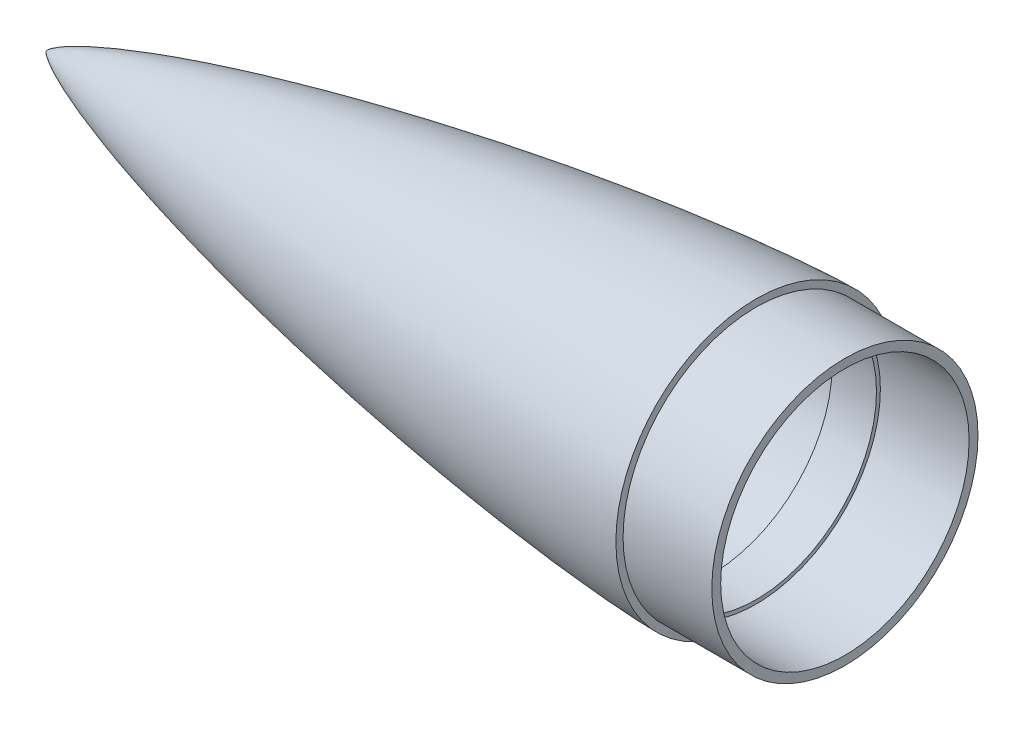
ISO-10303-21;
HEADER;
FILE_DESCRIPTION(('STEP AP214'),'2;1');
FILE_NAME('part.step','',(''),(''),'','','');
FILE_SCHEMA(('AUTOMOTIVE_DESIGN { 1 0 10303 214 1 1 1 1 }'));
ENDSEC;
DATA;
#1=APPLICATION_CONTEXT('core data for automotive mechanical design processes');
#2=APPLICATION_PROTOCOL_DEFINITION('international standard','automotive_design',2000,#1);
#3=PRODUCT_CONTEXT('',#1,'mechanical');
#4=PRODUCT('Part','Part','',(#3));
#5=PRODUCT_RELATED_PRODUCT_CATEGORY('part','',(#4));
#6=PRODUCT_DEFINITION_FORMATION('','',#4);
#7=PRODUCT_DEFINITION_CONTEXT('part definition',#1,'design');
#8=PRODUCT_DEFINITION('design','',#6,#7);
#9=PRODUCT_DEFINITION_SHAPE('','',#8);
#10=(LENGTH_UNIT() NAMED_UNIT(*) SI_UNIT(.MILLI.,.METRE.));
#11=(NAMED_UNIT(*) PLANE_ANGLE_UNIT() SI_UNIT($,.RADIAN.));
#12=(NAMED_UNIT(*) SI_UNIT($,.STERADIAN.) SOLID_ANGLE_UNIT());
#13=UNCERTAINTY_MEASURE_WITH_UNIT(LENGTH_MEASURE(1.E-05),#10,'distance_accuracy_value','');
#14=(GEOMETRIC_REPRESENTATION_CONTEXT(3) GLOBAL_UNCERTAINTY_ASSIGNED_CONTEXT((#13)) GLOBAL_UNIT_ASSIGNED_CONTEXT((#10,
#11,#12)) REPRESENTATION_CONTEXT('',''));
#15=CARTESIAN_POINT('',(0.,0.,0.));
#16=DIRECTION('',(0.,0.,1.));
#17=DIRECTION('',(1.,0.,0.));
#18=AXIS2_PLACEMENT_3D('',#15,#16,#17);
#19=CARTESIAN_POINT('',(203.2,0.,0.));
#20=DIRECTION('',(-1.,0.,0.));
#21=DIRECTION('',(0.,0.,1.));
#22=AXIS2_PLACEMENT_3D('',#19,#20,#21);
#23=PLANE('',#22);
#24=CARTESIAN_POINT('',(203.2,0.,0.));
#25=DIRECTION('',(1.,0.,0.));
#26=DIRECTION('',(0.,0.,-1.));
#27=AXIS2_PLACEMENT_3D('',#24,#25,#26);
#28=CIRCLE('',#27,34.442368486498);
#29=CARTESIAN_POINT('',(203.2,0.,-34.442368486498));
#30=VERTEX_POINT('',#29);
#31=EDGE_CURVE('E80',#30,#30,#28,.T.);
#32=ORIENTED_EDGE('',*,*,#31,.F.);
#33=EDGE_LOOP('',(#32));
#34=FACE_BOUND('',#33,.T.);
#35=CARTESIAN_POINT('',(203.2,0.,0.));
#36=DIRECTION('',(1.,0.,0.));
#37=DIRECTION('',(0.,0.,-1.));
#38=AXIS2_PLACEMENT_3D('',#35,#36,#37);
#39=CIRCLE('',#38,35.56);
#40=CARTESIAN_POINT('',(203.2,0.,-35.56));
#41=VERTEX_POINT('',#40);
#42=EDGE_CURVE('E120',#41,#41,#39,.T.);
#43=ORIENTED_EDGE('',*,*,#42,.T.);
#44=EDGE_LOOP('',(#43));
#45=FACE_BOUND('',#44,.T.);
#46=ADVANCED_FACE('F51',(#34,#45),#23,.F.);
#47=CARTESIAN_POINT('',(190.5,0.,0.));
#48=DIRECTION('',(1.,0.,0.));
#49=DIRECTION('',(0.,0.,-1.));
#50=AXIS2_PLACEMENT_3D('',#47,#48,#49);
#51=PLANE('',#50);
#52=CARTESIAN_POINT('',(190.5,0.,0.));
#53=DIRECTION('',(1.,0.,0.));
#54=DIRECTION('',(0.,0.,-1.));
#55=AXIS2_PLACEMENT_3D('',#52,#53,#54);
#56=CIRCLE('',#55,34.442368486498);
#57=CARTESIAN_POINT('',(190.5,0.,-34.442368486498));
#58=VERTEX_POINT('',#57);
#59=EDGE_CURVE('E76',#58,#58,#56,.T.);
#60=ORIENTED_EDGE('',*,*,#59,.T.);
#61=EDGE_LOOP('',(#60));
#62=FACE_BOUND('',#61,.T.);
#63=CARTESIAN_POINT('',(190.5,0.,0.));
#64=DIRECTION('',(-1.,0.,0.));
#65=DIRECTION('',(0.,0.,1.));
#66=AXIS2_PLACEMENT_3D('',#63,#64,#65);
#67=CIRCLE('',#66,36.4504521179472);
#68=CARTESIAN_POINT('',(190.5,0.,36.4504521179472));
#69=VERTEX_POINT('',#68);
#70=EDGE_CURVE('E74',#69,#69,#67,.F.);
#71=ORIENTED_EDGE('',*,*,#70,.F.);
#72=EDGE_LOOP('',(#71));
#73=FACE_BOUND('',#72,.T.);
#74=ADVANCED_FACE('F109',(#62,#73),#51,.F.);
#75=CARTESIAN_POINT('',(190.5,0.,0.));
#76=DIRECTION('',(1.,0.,0.));
#77=DIRECTION('',(0.,0.,-1.));
#78=AXIS2_PLACEMENT_3D('',#75,#76,#77);
#79=CYLINDRICAL_SURFACE('',#78,34.442368486498);
#80=ORIENTED_EDGE('',*,*,#59,.F.);
#81=EDGE_LOOP('',(#80));
#82=FACE_BOUND('',#81,.T.);
#83=ORIENTED_EDGE('',*,*,#31,.T.);
#84=EDGE_LOOP('',(#83));
#85=FACE_BOUND('',#84,.T.);
#86=ADVANCED_FACE('F70',(#82,#85),#79,.F.);
#87=CARTESIAN_POINT('',(203.2,40.1574,0.));
#88=CARTESIAN_POINT('',(202.642888700347,40.154988504579,0.));
#89=CARTESIAN_POINT('',(201.528796122096,40.13548785863,0.));
#90=CARTESIAN_POINT('',(199.301119206386,40.0758305330497,0.));
#91=CARTESIAN_POINT('',(193.805591174183,39.8511297254848,0.));
#92=CARTESIAN_POINT('',(185.605909670044,39.3499220615374,0.));
#93=CARTESIAN_POINT('',(174.712632822568,38.4615729306232,0.));
#94=CARTESIAN_POINT('',(161.692997011642,37.1398061344449,0.));
#95=CARTESIAN_POINT('',(148.697325261163,35.6018923883569,0.));
#96=CARTESIAN_POINT('',(135.726174590954,33.8696654407255,0.));
#97=CARTESIAN_POINT('',(122.780645373734,31.9557742173767,0.));
#98=CARTESIAN_POINT('',(109.862388625116,29.8656434766761,0.));
#99=CARTESIAN_POINT('',(96.9738602051591,27.5994708829041,0.));
#100=CARTESIAN_POINT('',(84.1184138597194,25.1522163645398,0.));
#101=CARTESIAN_POINT('',(71.3010367001658,22.512666100602,0.));
#102=CARTESIAN_POINT('',(58.5287162835062,19.6621250744182,0.));
#103=CARTESIAN_POINT('',(45.8128081461923,16.5689902477508,0.));
#104=CARTESIAN_POINT('',(33.4725518230326,13.2628108758953,0.));
#105=CARTESIAN_POINT('',(22.8031888405814,10.0580499065734,0.));
#106=CARTESIAN_POINT('',(14.3192981760078,7.1593789358061,0.));
#107=CARTESIAN_POINT('',(8.67445897575825,4.92684696664665,0.));
#108=CARTESIAN_POINT('',(5.83738753710413,3.65364110957339,0.));
#109=CARTESIAN_POINT('',(4.51579861346583,3.00316669751445,0.));
#110=CARTESIAN_POINT('',(4.17923587261654,2.83282049807762,0.));
#111=B_SPLINE_CURVE_WITH_KNOTS('',4,(#87,#88,#89,#90,#91,#92,#93,#94,#95,#96,#97,#98,#99,#100,
#101,#102,#103,#104,#105,#106,#107,#108,#109,#110),.UNSPECIFIED.,.F.,.F.,(5,1,1,1,1,1,1,1,1,1,1,
1,1,1,1,1,1,1,1,1,5),(0.,0.0106932339615156,0.0213864679230311,0.0427729358460623,
0.105565602051627,0.168358272740007,0.231150942377872,0.293943610120887,0.356736279142114,
0.41952894999035,0.482321614991817,0.545114283764546,0.607906950785019,0.670699620572828,
0.733492286155359,0.796284950883544,0.859077607983668,0.915883625487975,0.947279809563598,
0.968309918765469,0.975550162021418),.UNSPECIFIED.);
#112=CARTESIAN_POINT('',(0.,0.,0.));
#113=DIRECTION('',(-1.,0.,0.));
#114=AXIS1_PLACEMENT('',#112,#113);
#115=SURFACE_OF_REVOLUTION('',#111,#114);
#116=OFFSET_SURFACE('',#115,-3.175,.F.);
#117=CARTESIAN_POINT('',(5.6130256151072,0.,0.));
#118=VERTEX_POINT('',#117);
#119=VERTEX_LOOP('',#118);
#120=FACE_BOUND('',#119,.T.);
#121=ORIENTED_EDGE('',*,*,#70,.T.);
#122=EDGE_LOOP('',(#121));
#123=FACE_BOUND('',#122,.T.);
#124=ADVANCED_FACE('F66',(#120,#123),#116,.F.);
#125=CARTESIAN_POINT('',(228.6,0.,0.));
#126=DIRECTION('',(1.,0.,0.));
#127=DIRECTION('',(0.,0.,-1.));
#128=AXIS2_PLACEMENT_3D('',#125,#126,#127);
#129=PLANE('',#128);
#130=CARTESIAN_POINT('',(228.6,0.,0.));
#131=DIRECTION('',(1.,0.,0.));
#132=DIRECTION('',(0.,0.,-1.));
#133=AXIS2_PLACEMENT_3D('',#130,#131,#132);
#134=CIRCLE('',#133,38.1);
#135=CARTESIAN_POINT('',(228.6,0.,-38.1));
#136=VERTEX_POINT('',#135);
#137=EDGE_CURVE('E125',#136,#136,#134,.T.);
#138=ORIENTED_EDGE('',*,*,#137,.T.);
#139=EDGE_LOOP('',(#138));
#140=FACE_BOUND('',#139,.T.);
#141=CARTESIAN_POINT('',(228.6,0.,0.));
#142=DIRECTION('',(1.,0.,0.));
#143=DIRECTION('',(0.,0.,-1.));
#144=AXIS2_PLACEMENT_3D('',#141,#142,#143);
#145=CIRCLE('',#144,35.56);
#146=CARTESIAN_POINT('',(228.6,0.,-35.56));
#147=VERTEX_POINT('',#146);
#148=EDGE_CURVE('E122',#147,#147,#145,.T.);
#149=ORIENTED_EDGE('',*,*,#148,.F.);
#150=EDGE_LOOP('',(#149));
#151=FACE_BOUND('',#150,.T.);
#152=ADVANCED_FACE('F69',(#140,#151),#129,.T.);
#153=CARTESIAN_POINT('',(228.6,0.,0.));
#154=DIRECTION('',(-1.,0.,0.));
#155=DIRECTION('',(0.,0.,1.));
#156=AXIS2_PLACEMENT_3D('',#153,#154,#155);
#157=CYLINDRICAL_SURFACE('',#156,38.1);
#158=ORIENTED_EDGE('',*,*,#137,.F.);
#159=EDGE_LOOP('',(#158));
#160=FACE_BOUND('',#159,.T.);
#161=CARTESIAN_POINT('',(203.2,0.,0.));
#162=DIRECTION('',(-1.,0.,0.));
#163=DIRECTION('',(0.,0.,1.));
#164=AXIS2_PLACEMENT_3D('',#161,#162,#163);
#165=CIRCLE('',#164,38.1);
#166=CARTESIAN_POINT('',(203.2,0.,38.1));
#167=VERTEX_POINT('',#166);
#168=EDGE_CURVE('E12',#167,#167,#165,.F.);
#169=ORIENTED_EDGE('',*,*,#168,.T.);
#170=EDGE_LOOP('',(#169));
#171=FACE_BOUND('',#170,.T.);
#172=ADVANCED_FACE('F139',(#160,#171),#157,.T.);
#173=CARTESIAN_POINT('',(228.6,0.,0.));
#174=DIRECTION('',(-1.,0.,0.));
#175=DIRECTION('',(0.,0.,1.));
#176=AXIS2_PLACEMENT_3D('',#173,#174,#175);
#177=CYLINDRICAL_SURFACE('',#176,35.56);
#178=ORIENTED_EDGE('',*,*,#148,.T.);
#179=EDGE_LOOP('',(#178));
#180=FACE_BOUND('',#179,.T.);
#181=ORIENTED_EDGE('',*,*,#42,.F.);
#182=EDGE_LOOP('',(#181));
#183=FACE_BOUND('',#182,.T.);
#184=ADVANCED_FACE('F105',(#180,#183),#177,.F.);
#185=CARTESIAN_POINT('',(203.2,40.1574,0.));
#186=CARTESIAN_POINT('',(202.642888700347,40.154988504579,0.));
#187=CARTESIAN_POINT('',(201.528796122096,40.13548785863,0.));
#188=CARTESIAN_POINT('',(199.301119206386,40.0758305330497,0.));
#189=CARTESIAN_POINT('',(193.805591174183,39.8511297254848,0.));
#190=CARTESIAN_POINT('',(185.605909670044,39.3499220615374,0.));
#191=CARTESIAN_POINT('',(174.712632822568,38.4615729306232,0.));
#192=CARTESIAN_POINT('',(161.692997011642,37.1398061344449,0.));
#193=CARTESIAN_POINT('',(148.697325261163,35.6018923883569,0.));
#194=CARTESIAN_POINT('',(135.726174590954,33.8696654407255,0.));
#195=CARTESIAN_POINT('',(122.780645373734,31.9557742173767,0.));
#196=CARTESIAN_POINT('',(109.862388625116,29.8656434766761,0.));
#197=CARTESIAN_POINT('',(96.9738602051591,27.5994708829041,0.));
#198=CARTESIAN_POINT('',(84.1184138597194,25.1522163645398,0.));
#199=CARTESIAN_POINT('',(71.3010367001658,22.512666100602,0.));
#200=CARTESIAN_POINT('',(58.5287162835062,19.6621250744182,0.));
#201=CARTESIAN_POINT('',(45.8128081461923,16.5689902477508,0.));
#202=CARTESIAN_POINT('',(33.4725518230326,13.2628108758953,0.));
#203=CARTESIAN_POINT('',(22.8031888405814,10.0580499065734,0.));
#204=CARTESIAN_POINT('',(14.3192981760078,7.1593789358061,0.));
#205=CARTESIAN_POINT('',(8.403968043411,4.81986789560309,0.));
#206=CARTESIAN_POINT('',(4.95701560800275,3.25542307169066,0.));
#207=CARTESIAN_POINT('',(2.85495063599932,2.15581189142724,0.));
#208=CARTESIAN_POINT('',(1.64754090346704,1.42738156521697,0.));
#209=CARTESIAN_POINT('',(0.967137332107588,0.957092724307724,0.));
#210=CARTESIAN_POINT('',(0.578173578369669,0.650538117075583,0.));
#211=CARTESIAN_POINT('',(0.353649881513195,0.449691689234977,0.));
#212=CARTESIAN_POINT('',(0.213499505227476,0.308088227394301,0.));
#213=CARTESIAN_POINT('',(0.124578331421042,0.206312436259698,0.));
#214=CARTESIAN_POINT('',(0.0679199106579061,0.132188638096877,0.));
#215=CARTESIAN_POINT('',(0.0280745960459171,0.0690264295295098,0.));
#216=CARTESIAN_POINT('',(0.00885648199458586,0.0307200212803541,0.));
#217=CARTESIAN_POINT('',(0.0024197176554984,0.0104277823531019,0.));
#218=CARTESIAN_POINT('',(0.,0.,0.));
#219=B_SPLINE_CURVE_WITH_KNOTS('',4,(#185,#186,#187,#188,#189,#190,#191,#192,#193,#194,#195,
#196,#197,#198,#199,#200,#201,#202,#203,#204,#205,#206,#207,#208,#209,#210,#211,#212,#213,#214,
#215,#216,#217,#218),.UNSPECIFIED.,.F.,.F.,(5,1,1,1,1,1,1,1,1,1,1,1,1,1,1,1,1,1,1,1,1,1,1,1,1,1,
1,1,1,1,5),(0.,0.0106932339615156,0.0213864679230311,0.0427729358460623,0.105565602051627,
0.168358272740007,0.231150942377872,0.293943610120887,0.356736279142114,0.41952894999035,
0.482321614991817,0.545114283764546,0.607906950785019,0.670699620572828,0.733492286155359,
0.796284950883544,0.859077607983668,0.915883625487975,0.947279809563598,0.968309918765469,
0.981131325384431,0.9885074813014,0.99278880458772,0.995359428780861,0.996997588052518,
0.998007128264737,0.998567550710319,0.999181109058801,0.9995905545294,0.9997952772647,1.),.UNSPECIFIED.);
#220=CARTESIAN_POINT('',(0.,0.,0.));
#221=DIRECTION('',(-1.,0.,0.));
#222=AXIS1_PLACEMENT('',#220,#221);
#223=SURFACE_OF_REVOLUTION('',#219,#222);
#224=CARTESIAN_POINT('',(0.,0.,0.));
#225=VERTEX_POINT('',#224);
#226=VERTEX_LOOP('',#225);
#227=FACE_BOUND('',#226,.T.);
#228=CARTESIAN_POINT('',(203.2,0.,0.));
#229=DIRECTION('',(-1.,0.,0.));
#230=DIRECTION('',(0.,0.,1.));
#231=AXIS2_PLACEMENT_3D('',#228,#229,#230);
#232=CIRCLE('',#231,40.1574);
#233=CARTESIAN_POINT('',(203.2,0.,40.1574));
#234=VERTEX_POINT('',#233);
#235=EDGE_CURVE('E60',#234,#234,#232,.T.);
#236=ORIENTED_EDGE('',*,*,#235,.T.);
#237=EDGE_LOOP('',(#236));
#238=FACE_BOUND('',#237,.T.);
#239=ADVANCED_FACE('F53',(#227,#238),#223,.T.);
#240=ORIENTED_EDGE('',*,*,#168,.F.);
#241=EDGE_LOOP('',(#240));
#242=FACE_BOUND('',#241,.T.);
#243=ORIENTED_EDGE('',*,*,#235,.F.);
#244=EDGE_LOOP('',(#243));
#245=FACE_BOUND('',#244,.T.);
#246=ADVANCED_FACE('F99',(#242,#245),#23,.F.);
#247=CLOSED_SHELL('',(#46,#74,#86,#124,#152,#172,#184,#239,#246));
#248=MANIFOLD_SOLID_BREP('B2',#247);
#249=ADVANCED_BREP_SHAPE_REPRESENTATION('',(#18,#248),#14);
#250=SHAPE_DEFINITION_REPRESENTATION(#9,#249);
ENDSEC;
END-ISO-10303-21;
